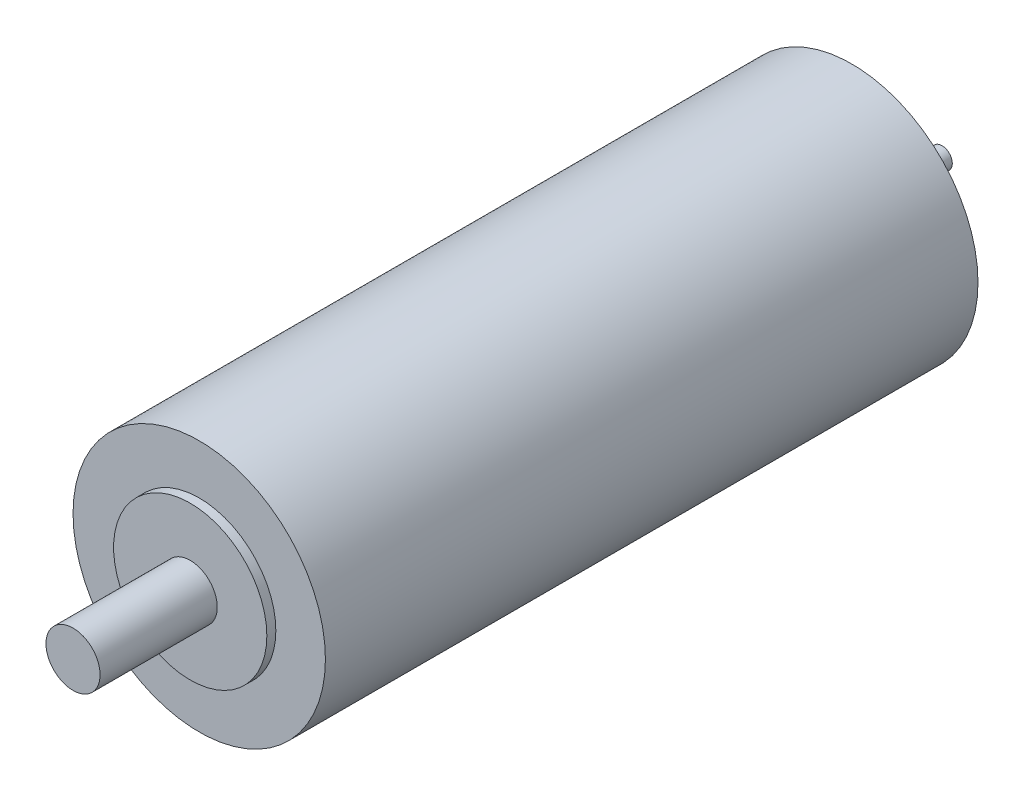
ISO-10303-21;
HEADER;
FILE_DESCRIPTION(('STEP AP214'),'2;1');
FILE_NAME('part.step','',(''),(''),'','','');
FILE_SCHEMA(('AUTOMOTIVE_DESIGN { 1 0 10303 214 1 1 1 1 }'));
ENDSEC;
DATA;
#1=APPLICATION_CONTEXT('core data for automotive mechanical design processes');
#2=APPLICATION_PROTOCOL_DEFINITION('international standard','automotive_design',2000,#1);
#3=PRODUCT_CONTEXT('',#1,'mechanical');
#4=PRODUCT('Part','Part','',(#3));
#5=PRODUCT_RELATED_PRODUCT_CATEGORY('part','',(#4));
#6=PRODUCT_DEFINITION_FORMATION('','',#4);
#7=PRODUCT_DEFINITION_CONTEXT('part definition',#1,'design');
#8=PRODUCT_DEFINITION('design','',#6,#7);
#9=PRODUCT_DEFINITION_SHAPE('','',#8);
#10=(LENGTH_UNIT() NAMED_UNIT(*) SI_UNIT(.MILLI.,.METRE.));
#11=(NAMED_UNIT(*) PLANE_ANGLE_UNIT() SI_UNIT($,.RADIAN.));
#12=(NAMED_UNIT(*) SI_UNIT($,.STERADIAN.) SOLID_ANGLE_UNIT());
#13=UNCERTAINTY_MEASURE_WITH_UNIT(LENGTH_MEASURE(1.E-05),#10,'distance_accuracy_value','');
#14=(GEOMETRIC_REPRESENTATION_CONTEXT(3) GLOBAL_UNCERTAINTY_ASSIGNED_CONTEXT((#13)) GLOBAL_UNIT_ASSIGNED_CONTEXT((#10,
#11,#12)) REPRESENTATION_CONTEXT('',''));
#15=CARTESIAN_POINT('',(0.,0.,0.));
#16=DIRECTION('',(0.,0.,1.));
#17=DIRECTION('',(1.,0.,0.));
#18=AXIS2_PLACEMENT_3D('',#15,#16,#17);
#19=CARTESIAN_POINT('',(0.,0.,36.2));
#20=DIRECTION('',(0.,0.,-1.));
#21=DIRECTION('',(-1.,0.,0.));
#22=AXIS2_PLACEMENT_3D('',#19,#20,#21);
#23=CYLINDRICAL_SURFACE('',#22,14.);
#24=CARTESIAN_POINT('',(0.,0.,36.2));
#25=DIRECTION('',(0.,0.,1.));
#26=DIRECTION('',(1.,0.,0.));
#27=AXIS2_PLACEMENT_3D('',#24,#25,#26);
#28=CIRCLE('',#27,14.);
#29=CARTESIAN_POINT('',(-14.,0.,36.2));
#30=VERTEX_POINT('',#29);
#31=EDGE_CURVE('E51',#30,#30,#28,.T.);
#32=CARTESIAN_POINT('',(0.,0.,-36.2));
#33=DIRECTION('',(0.,0.,1.));
#34=DIRECTION('',(1.,0.,0.));
#35=AXIS2_PLACEMENT_3D('',#32,#33,#34);
#36=CIRCLE('',#35,14.);
#37=CARTESIAN_POINT('',(-14.,0.,-36.2));
#38=VERTEX_POINT('',#37);
#39=EDGE_CURVE('E56',#38,#38,#36,.T.);
#40=CARTESIAN_POINT('',(-14.,0.,36.2));
#41=CARTESIAN_POINT('',(-14.,0.,35.4458333333333));
#42=CARTESIAN_POINT('',(-14.,0.,34.6916666666667));
#43=CARTESIAN_POINT('',(-14.,0.,33.1833333333333));
#44=CARTESIAN_POINT('',(-14.,0.,32.4291666666667));
#45=CARTESIAN_POINT('',(-14.,0.,30.9208333333333));
#46=CARTESIAN_POINT('',(-14.,0.,30.1666666666667));
#47=CARTESIAN_POINT('',(-14.,0.,28.6583333333333));
#48=CARTESIAN_POINT('',(-14.,0.,27.9041666666667));
#49=CARTESIAN_POINT('',(-14.,0.,26.3958333333333));
#50=CARTESIAN_POINT('',(-14.,0.,25.6416666666667));
#51=CARTESIAN_POINT('',(-14.,0.,24.1333333333333));
#52=CARTESIAN_POINT('',(-14.,0.,23.3791666666667));
#53=CARTESIAN_POINT('',(-14.,0.,21.8708333333333));
#54=CARTESIAN_POINT('',(-14.,0.,21.1166666666667));
#55=CARTESIAN_POINT('',(-14.,0.,19.6083333333333));
#56=CARTESIAN_POINT('',(-14.,0.,18.8541666666667));
#57=CARTESIAN_POINT('',(-14.,0.,17.3458333333333));
#58=CARTESIAN_POINT('',(-14.,0.,16.5916666666667));
#59=CARTESIAN_POINT('',(-14.,0.,15.0833333333333));
#60=CARTESIAN_POINT('',(-14.,0.,14.3291666666667));
#61=CARTESIAN_POINT('',(-14.,0.,12.8208333333333));
#62=CARTESIAN_POINT('',(-14.,0.,12.0666666666667));
#63=CARTESIAN_POINT('',(-14.,0.,10.5583333333333));
#64=CARTESIAN_POINT('',(-14.,0.,9.80416666666666));
#65=CARTESIAN_POINT('',(-14.,0.,8.29583333333333));
#66=CARTESIAN_POINT('',(-14.,0.,7.54166666666666));
#67=CARTESIAN_POINT('',(-14.,0.,6.03333333333333));
#68=CARTESIAN_POINT('',(-14.,0.,5.27916666666666));
#69=CARTESIAN_POINT('',(-14.,0.,3.77083333333333));
#70=CARTESIAN_POINT('',(-14.,0.,3.01666666666666));
#71=CARTESIAN_POINT('',(-14.,0.,1.50833333333333));
#72=CARTESIAN_POINT('',(-14.,0.,0.75416666666666));
#73=CARTESIAN_POINT('',(-14.,0.,-0.754166666666674));
#74=CARTESIAN_POINT('',(-14.,0.,-1.50833333333334));
#75=CARTESIAN_POINT('',(-14.,0.,-3.01666666666667));
#76=CARTESIAN_POINT('',(-14.,0.,-3.77083333333334));
#77=CARTESIAN_POINT('',(-14.,0.,-5.27916666666667));
#78=CARTESIAN_POINT('',(-14.,0.,-6.03333333333334));
#79=CARTESIAN_POINT('',(-14.,0.,-7.54166666666668));
#80=CARTESIAN_POINT('',(-14.,0.,-8.29583333333334));
#81=CARTESIAN_POINT('',(-14.,0.,-9.80416666666668));
#82=CARTESIAN_POINT('',(-14.,0.,-10.5583333333333));
#83=CARTESIAN_POINT('',(-14.,0.,-12.0666666666667));
#84=CARTESIAN_POINT('',(-14.,0.,-12.8208333333333));
#85=CARTESIAN_POINT('',(-14.,0.,-14.3291666666667));
#86=CARTESIAN_POINT('',(-14.,0.,-15.0833333333333));
#87=CARTESIAN_POINT('',(-14.,0.,-16.5916666666667));
#88=CARTESIAN_POINT('',(-14.,0.,-17.3458333333333));
#89=CARTESIAN_POINT('',(-14.,0.,-18.8541666666667));
#90=CARTESIAN_POINT('',(-14.,0.,-19.6083333333333));
#91=CARTESIAN_POINT('',(-14.,0.,-21.1166666666667));
#92=CARTESIAN_POINT('',(-14.,0.,-21.8708333333333));
#93=CARTESIAN_POINT('',(-14.,0.,-23.3791666666667));
#94=CARTESIAN_POINT('',(-14.,0.,-24.1333333333333));
#95=CARTESIAN_POINT('',(-14.,0.,-25.6416666666667));
#96=CARTESIAN_POINT('',(-14.,0.,-26.3958333333333));
#97=CARTESIAN_POINT('',(-14.,0.,-27.9041666666667));
#98=CARTESIAN_POINT('',(-14.,0.,-28.6583333333333));
#99=CARTESIAN_POINT('',(-14.,0.,-30.1666666666667));
#100=CARTESIAN_POINT('',(-14.,0.,-30.9208333333333));
#101=CARTESIAN_POINT('',(-14.,0.,-32.4291666666667));
#102=CARTESIAN_POINT('',(-14.,0.,-33.1833333333333));
#103=CARTESIAN_POINT('',(-14.,0.,-34.6916666666667));
#104=CARTESIAN_POINT('',(-14.,0.,-35.4458333333333));
#105=CARTESIAN_POINT('',(-14.,0.,-36.2));
#106=B_SPLINE_CURVE_WITH_KNOTS('',3,(#40,#41,#42,#43,#44,#45,#46,#47,#48,#49,#50,#51,#52,#53,
#54,#55,#56,#57,#58,#59,#60,#61,#62,#63,#64,#65,#66,#67,#68,#69,#70,#71,#72,#73,#74,#75,#76,#77,
#78,#79,#80,#81,#82,#83,#84,#85,#86,#87,#88,#89,#90,#91,#92,#93,#94,#95,#96,#97,#98,#99,#100,
#101,#102,#103,#104,#105),.UNSPECIFIED.,.F.,.F.,(4,2,2,2,2,2,2,2,2,2,2,2,2,2,2,2,2,2,2,2,2,2,2,
2,2,2,2,2,2,2,2,2,4),(0.,2.26249999999999,4.52499999999999,6.7875,9.05,11.3125,13.575,15.8375,
18.1,20.3625,22.625,24.8875,27.15,29.4125,31.675,33.9375,36.2,38.4625,40.725,42.9875,45.25,
47.5125,49.775,52.0375,54.3,56.5625,58.825,61.0875,63.35,65.6125,67.875,70.1375,72.4),.UNSPECIFIED.);
#107=EDGE_CURVE('BSEAM41',#30,#38,#106,.T.);
#108=ORIENTED_EDGE('',*,*,#31,.F.);
#109=ORIENTED_EDGE('',*,*,#39,.T.);
#110=ORIENTED_EDGE('',*,*,#107,.T.);
#111=ORIENTED_EDGE('',*,*,#107,.F.);
#112=EDGE_LOOP('',(#108,#110,#109,#111));
#113=FACE_BOUND('',#112,.T.);
#114=ADVANCED_FACE('F41',(#113),#23,.T.);
#115=CARTESIAN_POINT('',(0.,0.,36.2));
#116=DIRECTION('',(0.,0.,1.));
#117=DIRECTION('',(1.,0.,0.));
#118=AXIS2_PLACEMENT_3D('',#115,#116,#117);
#119=PLANE('',#118);
#120=CARTESIAN_POINT('',(0.,0.,36.2));
#121=DIRECTION('',(0.,0.,1.));
#122=DIRECTION('',(1.,0.,0.));
#123=AXIS2_PLACEMENT_3D('',#120,#121,#122);
#124=CIRCLE('',#123,8.5);
#125=CARTESIAN_POINT('',(8.5,0.,36.2));
#126=VERTEX_POINT('',#125);
#127=EDGE_CURVE('E64',#126,#126,#124,.F.);
#128=ORIENTED_EDGE('',*,*,#127,.T.);
#129=EDGE_LOOP('',(#128));
#130=FACE_BOUND('',#129,.T.);
#131=ORIENTED_EDGE('',*,*,#31,.T.);
#132=EDGE_LOOP('',(#131));
#133=FACE_BOUND('',#132,.T.);
#134=ADVANCED_FACE('F70',(#130,#133),#119,.T.);
#135=CARTESIAN_POINT('',(0.,0.,-36.2));
#136=DIRECTION('',(0.,0.,1.));
#137=DIRECTION('',(1.,0.,0.));
#138=AXIS2_PLACEMENT_3D('',#135,#136,#137);
#139=PLANE('',#138);
#140=CARTESIAN_POINT('',(0.,0.,-36.2));
#141=DIRECTION('',(0.,0.,1.));
#142=DIRECTION('',(1.,0.,0.));
#143=AXIS2_PLACEMENT_3D('',#140,#141,#142);
#144=CIRCLE('',#143,1.15);
#145=CARTESIAN_POINT('',(1.15,0.,-36.2));
#146=VERTEX_POINT('',#145);
#147=EDGE_CURVE('E10',#146,#146,#144,.F.);
#148=ORIENTED_EDGE('',*,*,#147,.F.);
#149=EDGE_LOOP('',(#148));
#150=FACE_BOUND('',#149,.T.);
#151=ORIENTED_EDGE('',*,*,#39,.F.);
#152=EDGE_LOOP('',(#151));
#153=FACE_BOUND('',#152,.T.);
#154=ADVANCED_FACE('F77',(#150,#153),#139,.F.);
#155=CARTESIAN_POINT('',(0.,0.,37.2));
#156=DIRECTION('',(0.,0.,-1.));
#157=DIRECTION('',(-1.,0.,0.));
#158=AXIS2_PLACEMENT_3D('',#155,#156,#157);
#159=CYLINDRICAL_SURFACE('',#158,8.5);
#160=ORIENTED_EDGE('',*,*,#127,.F.);
#161=EDGE_LOOP('',(#160));
#162=FACE_BOUND('',#161,.T.);
#163=CARTESIAN_POINT('',(0.,0.,37.2));
#164=DIRECTION('',(0.,0.,1.));
#165=DIRECTION('',(1.,0.,0.));
#166=AXIS2_PLACEMENT_3D('',#163,#164,#165);
#167=CIRCLE('',#166,8.5);
#168=CARTESIAN_POINT('',(8.5,0.,37.2));
#169=VERTEX_POINT('',#168);
#170=EDGE_CURVE('E62',#169,#169,#167,.T.);
#171=ORIENTED_EDGE('',*,*,#170,.F.);
#172=EDGE_LOOP('',(#171));
#173=FACE_BOUND('',#172,.T.);
#174=ADVANCED_FACE('F73',(#162,#173),#159,.T.);
#175=CARTESIAN_POINT('',(0.,0.,37.2));
#176=DIRECTION('',(0.,0.,1.));
#177=DIRECTION('',(1.,0.,0.));
#178=AXIS2_PLACEMENT_3D('',#175,#176,#177);
#179=PLANE('',#178);
#180=CARTESIAN_POINT('',(0.,0.,37.2));
#181=DIRECTION('',(0.,0.,1.));
#182=DIRECTION('',(1.,0.,0.));
#183=AXIS2_PLACEMENT_3D('',#180,#181,#182);
#184=CIRCLE('',#183,3.);
#185=CARTESIAN_POINT('',(-3.,0.,37.2));
#186=VERTEX_POINT('',#185);
#187=EDGE_CURVE('E47',#186,#186,#184,.T.);
#188=ORIENTED_EDGE('',*,*,#187,.F.);
#189=EDGE_LOOP('',(#188));
#190=FACE_BOUND('',#189,.T.);
#191=ORIENTED_EDGE('',*,*,#170,.T.);
#192=EDGE_LOOP('',(#191));
#193=FACE_BOUND('',#192,.T.);
#194=ADVANCED_FACE('F76',(#190,#193),#179,.T.);
#195=CARTESIAN_POINT('',(0.,0.,50.2));
#196=DIRECTION('',(0.,0.,-1.));
#197=DIRECTION('',(-1.,0.,0.));
#198=AXIS2_PLACEMENT_3D('',#195,#196,#197);
#199=CYLINDRICAL_SURFACE('',#198,3.);
#200=CARTESIAN_POINT('',(0.,0.,50.2));
#201=DIRECTION('',(0.,0.,1.));
#202=DIRECTION('',(1.,0.,0.));
#203=AXIS2_PLACEMENT_3D('',#200,#201,#202);
#204=CIRCLE('',#203,3.);
#205=CARTESIAN_POINT('',(-3.,0.,50.2));
#206=VERTEX_POINT('',#205);
#207=EDGE_CURVE('E60',#206,#206,#204,.T.);
#208=CARTESIAN_POINT('',(-3.,0.,50.2));
#209=CARTESIAN_POINT('',(-3.,0.,50.0645833333333));
#210=CARTESIAN_POINT('',(-3.,0.,49.9291666666667));
#211=CARTESIAN_POINT('',(-3.,0.,49.6583333333333));
#212=CARTESIAN_POINT('',(-3.,0.,49.5229166666667));
#213=CARTESIAN_POINT('',(-3.,0.,49.2520833333333));
#214=CARTESIAN_POINT('',(-3.,0.,49.1166666666667));
#215=CARTESIAN_POINT('',(-3.,0.,48.8458333333333));
#216=CARTESIAN_POINT('',(-3.,0.,48.7104166666667));
#217=CARTESIAN_POINT('',(-3.,0.,48.4395833333333));
#218=CARTESIAN_POINT('',(-3.,0.,48.3041666666667));
#219=CARTESIAN_POINT('',(-3.,0.,48.0333333333333));
#220=CARTESIAN_POINT('',(-3.,0.,47.8979166666667));
#221=CARTESIAN_POINT('',(-3.,0.,47.6270833333333));
#222=CARTESIAN_POINT('',(-3.,0.,47.4916666666667));
#223=CARTESIAN_POINT('',(-3.,0.,47.2208333333333));
#224=CARTESIAN_POINT('',(-3.,0.,47.0854166666667));
#225=CARTESIAN_POINT('',(-3.,0.,46.8145833333333));
#226=CARTESIAN_POINT('',(-3.,0.,46.6791666666667));
#227=CARTESIAN_POINT('',(-3.,0.,46.4083333333333));
#228=CARTESIAN_POINT('',(-3.,0.,46.2729166666667));
#229=CARTESIAN_POINT('',(-3.,0.,46.0020833333333));
#230=CARTESIAN_POINT('',(-3.,0.,45.8666666666667));
#231=CARTESIAN_POINT('',(-3.,0.,45.5958333333333));
#232=CARTESIAN_POINT('',(-3.,0.,45.4604166666667));
#233=CARTESIAN_POINT('',(-3.,0.,45.1895833333333));
#234=CARTESIAN_POINT('',(-3.,0.,45.0541666666667));
#235=CARTESIAN_POINT('',(-3.,0.,44.7833333333333));
#236=CARTESIAN_POINT('',(-3.,0.,44.6479166666667));
#237=CARTESIAN_POINT('',(-3.,0.,44.3770833333333));
#238=CARTESIAN_POINT('',(-3.,0.,44.2416666666667));
#239=CARTESIAN_POINT('',(-3.,0.,43.9708333333333));
#240=CARTESIAN_POINT('',(-3.,0.,43.8354166666667));
#241=CARTESIAN_POINT('',(-3.,0.,43.5645833333333));
#242=CARTESIAN_POINT('',(-3.,0.,43.4291666666667));
#243=CARTESIAN_POINT('',(-3.,0.,43.1583333333333));
#244=CARTESIAN_POINT('',(-3.,0.,43.0229166666667));
#245=CARTESIAN_POINT('',(-3.,0.,42.7520833333333));
#246=CARTESIAN_POINT('',(-3.,0.,42.6166666666667));
#247=CARTESIAN_POINT('',(-3.,0.,42.3458333333333));
#248=CARTESIAN_POINT('',(-3.,0.,42.2104166666667));
#249=CARTESIAN_POINT('',(-3.,0.,41.9395833333333));
#250=CARTESIAN_POINT('',(-3.,0.,41.8041666666667));
#251=CARTESIAN_POINT('',(-3.,0.,41.5333333333333));
#252=CARTESIAN_POINT('',(-3.,0.,41.3979166666667));
#253=CARTESIAN_POINT('',(-3.,0.,41.1270833333333));
#254=CARTESIAN_POINT('',(-3.,0.,40.9916666666667));
#255=CARTESIAN_POINT('',(-3.,0.,40.7208333333333));
#256=CARTESIAN_POINT('',(-3.,0.,40.5854166666667));
#257=CARTESIAN_POINT('',(-3.,0.,40.3145833333333));
#258=CARTESIAN_POINT('',(-3.,0.,40.1791666666667));
#259=CARTESIAN_POINT('',(-3.,0.,39.9083333333333));
#260=CARTESIAN_POINT('',(-3.,0.,39.7729166666667));
#261=CARTESIAN_POINT('',(-3.,0.,39.5020833333333));
#262=CARTESIAN_POINT('',(-3.,0.,39.3666666666667));
#263=CARTESIAN_POINT('',(-3.,0.,39.0958333333333));
#264=CARTESIAN_POINT('',(-3.,0.,38.9604166666667));
#265=CARTESIAN_POINT('',(-3.,0.,38.6895833333333));
#266=CARTESIAN_POINT('',(-3.,0.,38.5541666666667));
#267=CARTESIAN_POINT('',(-3.,0.,38.2833333333333));
#268=CARTESIAN_POINT('',(-3.,0.,38.1479166666667));
#269=CARTESIAN_POINT('',(-3.,0.,37.8770833333333));
#270=CARTESIAN_POINT('',(-3.,0.,37.7416666666667));
#271=CARTESIAN_POINT('',(-3.,0.,37.4708333333333));
#272=CARTESIAN_POINT('',(-3.,0.,37.3354166666667));
#273=CARTESIAN_POINT('',(-3.,0.,37.2));
#274=B_SPLINE_CURVE_WITH_KNOTS('',3,(#208,#209,#210,#211,#212,#213,#214,#215,#216,#217,#218,
#219,#220,#221,#222,#223,#224,#225,#226,#227,#228,#229,#230,#231,#232,#233,#234,#235,#236,#237,
#238,#239,#240,#241,#242,#243,#244,#245,#246,#247,#248,#249,#250,#251,#252,#253,#254,#255,#256,
#257,#258,#259,#260,#261,#262,#263,#264,#265,#266,#267,#268,#269,#270,#271,#272,#273),
.UNSPECIFIED.,.F.,.F.,(4,2,2,2,2,2,2,2,2,2,2,2,2,2,2,2,2,2,2,2,2,2,2,2,2,2,2,2,2,2,2,2,4),(0.,
0.406250000000004,0.812500000000001,1.21875,1.625,2.03125000000001,2.4375,2.84375,3.25,3.65625,
4.0625,4.46875,4.875,5.28125,5.68750000000001,6.09375,6.5,6.90625,7.3125,7.71875,8.125,8.53125,
8.9375,9.34375,9.75,10.15625,10.5625,10.96875,11.375,11.78125,12.1875,12.59375,13.),.UNSPECIFIED.);
#275=EDGE_CURVE('BSEAM82',#206,#186,#274,.T.);
#276=ORIENTED_EDGE('',*,*,#207,.F.);
#277=ORIENTED_EDGE('',*,*,#187,.T.);
#278=ORIENTED_EDGE('',*,*,#275,.T.);
#279=ORIENTED_EDGE('',*,*,#275,.F.);
#280=EDGE_LOOP('',(#276,#278,#277,#279));
#281=FACE_BOUND('',#280,.T.);
#282=ADVANCED_FACE('F82',(#281),#199,.T.);
#283=CARTESIAN_POINT('',(0.,0.,50.2));
#284=DIRECTION('',(0.,0.,1.));
#285=DIRECTION('',(1.,0.,0.));
#286=AXIS2_PLACEMENT_3D('',#283,#284,#285);
#287=PLANE('',#286);
#288=ORIENTED_EDGE('',*,*,#207,.T.);
#289=EDGE_LOOP('',(#288));
#290=FACE_BOUND('',#289,.T.);
#291=ADVANCED_FACE('F88',(#290),#287,.T.);
#292=CARTESIAN_POINT('',(0.,0.,-46.2));
#293=DIRECTION('',(0.,0.,1.));
#294=DIRECTION('',(1.,0.,0.));
#295=AXIS2_PLACEMENT_3D('',#292,#293,#294);
#296=CYLINDRICAL_SURFACE('',#295,1.15);
#297=CARTESIAN_POINT('',(0.,0.,-46.2));
#298=DIRECTION('',(0.,0.,-1.));
#299=DIRECTION('',(-1.,0.,0.));
#300=AXIS2_PLACEMENT_3D('',#297,#298,#299);
#301=CIRCLE('',#300,1.15);
#302=CARTESIAN_POINT('',(-1.15,0.,-46.2));
#303=VERTEX_POINT('',#302);
#304=EDGE_CURVE('E168',#303,#303,#301,.T.);
#305=ORIENTED_EDGE('',*,*,#304,.F.);
#306=EDGE_LOOP('',(#305));
#307=FACE_BOUND('',#306,.T.);
#308=ORIENTED_EDGE('',*,*,#147,.T.);
#309=EDGE_LOOP('',(#308));
#310=FACE_BOUND('',#309,.T.);
#311=ADVANCED_FACE('F114',(#307,#310),#296,.T.);
#312=CARTESIAN_POINT('',(0.,0.,-46.2));
#313=DIRECTION('',(0.,0.,-1.));
#314=DIRECTION('',(-1.,0.,0.));
#315=AXIS2_PLACEMENT_3D('',#312,#313,#314);
#316=PLANE('',#315);
#317=ORIENTED_EDGE('',*,*,#304,.T.);
#318=EDGE_LOOP('',(#317));
#319=FACE_BOUND('',#318,.T.);
#320=ADVANCED_FACE('F118',(#319),#316,.T.);
#321=CLOSED_SHELL('',(#114,#134,#154,#174,#194,#282,#291,#311,#320));
#322=MANIFOLD_SOLID_BREP('B2',#321);
#323=ADVANCED_BREP_SHAPE_REPRESENTATION('',(#18,#322),#14);
#324=SHAPE_DEFINITION_REPRESENTATION(#9,#323);
ENDSEC;
END-ISO-10303-21;
